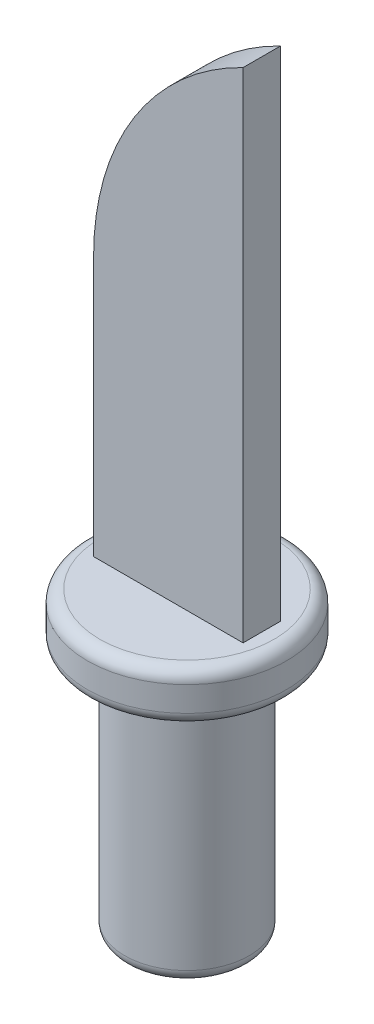
ISO-10303-21;
HEADER;
FILE_DESCRIPTION(('STEP AP214'),'2;1');
FILE_NAME('part.step','',(''),(''),'','','');
FILE_SCHEMA(('AUTOMOTIVE_DESIGN { 1 0 10303 214 1 1 1 1 }'));
ENDSEC;
DATA;
#1=APPLICATION_CONTEXT('core data for automotive mechanical design processes');
#2=APPLICATION_PROTOCOL_DEFINITION('international standard','automotive_design',2000,#1);
#3=PRODUCT_CONTEXT('',#1,'mechanical');
#4=PRODUCT('Part','Part','',(#3));
#5=PRODUCT_RELATED_PRODUCT_CATEGORY('part','',(#4));
#6=PRODUCT_DEFINITION_FORMATION('','',#4);
#7=PRODUCT_DEFINITION_CONTEXT('part definition',#1,'design');
#8=PRODUCT_DEFINITION('design','',#6,#7);
#9=PRODUCT_DEFINITION_SHAPE('','',#8);
#10=(LENGTH_UNIT() NAMED_UNIT(*) SI_UNIT(.MILLI.,.METRE.));
#11=(NAMED_UNIT(*) PLANE_ANGLE_UNIT() SI_UNIT($,.RADIAN.));
#12=(NAMED_UNIT(*) SI_UNIT($,.STERADIAN.) SOLID_ANGLE_UNIT());
#13=UNCERTAINTY_MEASURE_WITH_UNIT(LENGTH_MEASURE(1.E-05),#10,'distance_accuracy_value','');
#14=(GEOMETRIC_REPRESENTATION_CONTEXT(3) GLOBAL_UNCERTAINTY_ASSIGNED_CONTEXT((#13)) GLOBAL_UNIT_ASSIGNED_CONTEXT((#10,
#11,#12)) REPRESENTATION_CONTEXT('',''));
#15=CARTESIAN_POINT('',(0.,0.,0.));
#16=DIRECTION('',(0.,0.,1.));
#17=DIRECTION('',(1.,0.,0.));
#18=AXIS2_PLACEMENT_3D('',#15,#16,#17);
#19=CARTESIAN_POINT('',(0.692849814534637,117.952562857232,0.));
#20=DIRECTION('',(0.,1.,0.));
#21=DIRECTION('',(0.,0.,1.));
#22=AXIS2_PLACEMENT_3D('',#19,#20,#21);
#23=PLANE('',#22);
#24=CARTESIAN_POINT('',(0.692849814534637,117.952562857232,0.));
#25=DIRECTION('',(0.,1.,0.));
#26=DIRECTION('',(0.,0.,1.));
#27=AXIS2_PLACEMENT_3D('',#24,#25,#26);
#28=CIRCLE('',#27,1.75);
#29=CARTESIAN_POINT('',(0.692849814534637,117.952562857232,1.75));
#30=VERTEX_POINT('',#29);
#31=EDGE_CURVE('E119',#30,#30,#28,.T.);
#32=ORIENTED_EDGE('',*,*,#31,.T.);
#33=EDGE_LOOP('',(#32));
#34=FACE_BOUND('',#33,.T.);
#35=DIRECTION('',(1.,0.,0.));
#36=VECTOR('',#35,1.);
#37=CARTESIAN_POINT('',(2.19284981453464,117.952562857232,0.374999999999998));
#38=LINE('',#37,#36);
#39=CARTESIAN_POINT('',(-0.807150185465362,117.952562857232,0.374999999999998));
#40=VERTEX_POINT('',#39);
#41=CARTESIAN_POINT('',(2.19284981453464,117.952562857232,0.374999999999998));
#42=VERTEX_POINT('',#41);
#43=EDGE_CURVE('E82',#40,#42,#38,.T.);
#44=ORIENTED_EDGE('',*,*,#43,.F.);
#45=DIRECTION('',(0.,0.,1.));
#46=VECTOR('',#45,1.);
#47=CARTESIAN_POINT('',(-0.807150185465362,117.952562857232,0.374999999999998));
#48=LINE('',#47,#46);
#49=CARTESIAN_POINT('',(-0.807150185465362,117.952562857232,-0.375000000000002));
#50=VERTEX_POINT('',#49);
#51=EDGE_CURVE('E94',#50,#40,#48,.T.);
#52=ORIENTED_EDGE('',*,*,#51,.F.);
#53=DIRECTION('',(-1.,0.,0.));
#54=VECTOR('',#53,1.);
#55=CARTESIAN_POINT('',(2.19284981453464,117.952562857232,-0.375000000000002));
#56=LINE('',#55,#54);
#57=CARTESIAN_POINT('',(2.19284981453464,117.952562857232,-0.375000000000002));
#58=VERTEX_POINT('',#57);
#59=EDGE_CURVE('E101',#58,#50,#56,.T.);
#60=ORIENTED_EDGE('',*,*,#59,.F.);
#61=DIRECTION('',(0.,0.,-1.));
#62=VECTOR('',#61,1.);
#63=CARTESIAN_POINT('',(2.19284981453464,117.952562857232,0.374999999999998));
#64=LINE('',#63,#62);
#65=EDGE_CURVE('E93',#42,#58,#64,.T.);
#66=ORIENTED_EDGE('',*,*,#65,.F.);
#67=EDGE_LOOP('',(#44,#52,#60,#66));
#68=FACE_BOUND('',#67,.T.);
#69=ADVANCED_FACE('F44',(#34,#68),#23,.T.);
#70=CARTESIAN_POINT('',(0.692849814534637,111.952562857232,0.));
#71=DIRECTION('',(0.,1.,0.));
#72=DIRECTION('',(0.,0.,1.));
#73=AXIS2_PLACEMENT_3D('',#70,#71,#72);
#74=PLANE('',#73);
#75=CARTESIAN_POINT('',(0.692849814534637,111.952562857232,0.));
#76=DIRECTION('',(0.,1.,0.));
#77=DIRECTION('',(0.,0.,1.));
#78=AXIS2_PLACEMENT_3D('',#75,#76,#77);
#79=CIRCLE('',#78,1.);
#80=CARTESIAN_POINT('',(0.692849814534637,111.952562857232,0.999999999999998));
#81=VERTEX_POINT('',#80);
#82=EDGE_CURVE('E116',#81,#81,#79,.F.);
#83=ORIENTED_EDGE('',*,*,#82,.T.);
#84=EDGE_LOOP('',(#83));
#85=FACE_BOUND('',#84,.T.);
#86=ADVANCED_FACE('F137',(#85),#74,.F.);
#87=CARTESIAN_POINT('',(0.692849814534637,111.952562857232,0.));
#88=DIRECTION('',(0.,1.,0.));
#89=DIRECTION('',(0.,0.,1.));
#90=AXIS2_PLACEMENT_3D('',#87,#88,#89);
#91=CYLINDRICAL_SURFACE('',#90,1.25);
#92=CARTESIAN_POINT('',(0.692849814534637,112.202562857232,0.));
#93=DIRECTION('',(0.,1.,0.));
#94=DIRECTION('',(0.,0.,1.));
#95=AXIS2_PLACEMENT_3D('',#92,#93,#94);
#96=CIRCLE('',#95,1.25);
#97=CARTESIAN_POINT('',(0.692849814534637,112.202562857232,1.25));
#98=VERTEX_POINT('',#97);
#99=EDGE_CURVE('E113',#98,#98,#96,.T.);
#100=ORIENTED_EDGE('',*,*,#99,.T.);
#101=EDGE_LOOP('',(#100));
#102=FACE_BOUND('',#101,.T.);
#103=CARTESIAN_POINT('',(0.692849814534637,116.952562857232,0.));
#104=DIRECTION('',(0.,1.,0.));
#105=DIRECTION('',(0.,0.,1.));
#106=AXIS2_PLACEMENT_3D('',#103,#104,#105);
#107=CIRCLE('',#106,1.25);
#108=CARTESIAN_POINT('',(0.692849814534637,116.952562857232,1.25));
#109=VERTEX_POINT('',#108);
#110=EDGE_CURVE('E110',#109,#109,#107,.T.);
#111=ORIENTED_EDGE('',*,*,#110,.F.);
#112=EDGE_LOOP('',(#111));
#113=FACE_BOUND('',#112,.T.);
#114=ADVANCED_FACE('F139',(#102,#113),#91,.T.);
#115=CARTESIAN_POINT('',(0.692849814534637,117.952562857232,0.));
#116=DIRECTION('',(0.,-1.,0.));
#117=DIRECTION('',(0.,0.,-1.));
#118=AXIS2_PLACEMENT_3D('',#115,#116,#117);
#119=CYLINDRICAL_SURFACE('',#118,2.);
#120=CARTESIAN_POINT('',(0.692849814534637,117.702562857232,0.));
#121=DIRECTION('',(0.,1.,0.));
#122=DIRECTION('',(0.,0.,1.));
#123=AXIS2_PLACEMENT_3D('',#120,#121,#122);
#124=CIRCLE('',#123,2.);
#125=CARTESIAN_POINT('',(0.692849814534637,117.702562857232,2.));
#126=VERTEX_POINT('',#125);
#127=EDGE_CURVE('E52',#126,#126,#124,.F.);
#128=ORIENTED_EDGE('',*,*,#127,.T.);
#129=EDGE_LOOP('',(#128));
#130=FACE_BOUND('',#129,.T.);
#131=CARTESIAN_POINT('',(0.692849814534637,117.202562857232,0.));
#132=DIRECTION('',(0.,1.,0.));
#133=DIRECTION('',(0.,0.,1.));
#134=AXIS2_PLACEMENT_3D('',#131,#132,#133);
#135=CIRCLE('',#134,2.);
#136=CARTESIAN_POINT('',(0.692849814534637,117.202562857232,2.));
#137=VERTEX_POINT('',#136);
#138=EDGE_CURVE('E122',#137,#137,#135,.T.);
#139=ORIENTED_EDGE('',*,*,#138,.T.);
#140=EDGE_LOOP('',(#139));
#141=FACE_BOUND('',#140,.T.);
#142=ADVANCED_FACE('F127',(#130,#141),#119,.T.);
#143=CARTESIAN_POINT('',(0.692849814534637,116.952562857232,0.));
#144=DIRECTION('',(0.,1.,0.));
#145=DIRECTION('',(0.,0.,1.));
#146=AXIS2_PLACEMENT_3D('',#143,#144,#145);
#147=PLANE('',#146);
#148=CARTESIAN_POINT('',(0.692849814534637,116.952562857232,0.));
#149=DIRECTION('',(0.,1.,0.));
#150=DIRECTION('',(0.,0.,1.));
#151=AXIS2_PLACEMENT_3D('',#148,#149,#150);
#152=CIRCLE('',#151,1.75);
#153=CARTESIAN_POINT('',(0.692849814534637,116.952562857232,1.75));
#154=VERTEX_POINT('',#153);
#155=EDGE_CURVE('E12',#154,#154,#152,.F.);
#156=ORIENTED_EDGE('',*,*,#155,.T.);
#157=EDGE_LOOP('',(#156));
#158=FACE_BOUND('',#157,.T.);
#159=ORIENTED_EDGE('',*,*,#110,.T.);
#160=EDGE_LOOP('',(#159));
#161=FACE_BOUND('',#160,.T.);
#162=ADVANCED_FACE('F155',(#158,#161),#147,.F.);
#163=CARTESIAN_POINT('',(0.692849814534637,112.202562857232,0.));
#164=DIRECTION('',(0.,1.,0.));
#165=DIRECTION('',(0.,0.,1.));
#166=AXIS2_PLACEMENT_3D('',#163,#164,#165);
#167=TOROIDAL_SURFACE('',#166,1.,0.25);
#168=ORIENTED_EDGE('',*,*,#82,.F.);
#169=EDGE_LOOP('',(#168));
#170=FACE_BOUND('',#169,.T.);
#171=ORIENTED_EDGE('',*,*,#99,.F.);
#172=EDGE_LOOP('',(#171));
#173=FACE_BOUND('',#172,.T.);
#174=ADVANCED_FACE('F133',(#170,#173),#167,.T.);
#175=CARTESIAN_POINT('',(0.692849814534637,117.702562857232,0.));
#176=DIRECTION('',(0.,1.,0.));
#177=DIRECTION('',(0.,0.,1.));
#178=AXIS2_PLACEMENT_3D('',#175,#176,#177);
#179=TOROIDAL_SURFACE('',#178,1.75,0.25);
#180=ORIENTED_EDGE('',*,*,#127,.F.);
#181=EDGE_LOOP('',(#180));
#182=FACE_BOUND('',#181,.T.);
#183=ORIENTED_EDGE('',*,*,#31,.F.);
#184=EDGE_LOOP('',(#183));
#185=FACE_BOUND('',#184,.T.);
#186=ADVANCED_FACE('F130',(#182,#185),#179,.T.);
#187=CARTESIAN_POINT('',(0.692849814534637,117.202562857232,0.));
#188=DIRECTION('',(0.,1.,0.));
#189=DIRECTION('',(0.,0.,1.));
#190=AXIS2_PLACEMENT_3D('',#187,#188,#189);
#191=TOROIDAL_SURFACE('',#190,1.75,0.25);
#192=ORIENTED_EDGE('',*,*,#155,.F.);
#193=EDGE_LOOP('',(#192));
#194=FACE_BOUND('',#193,.T.);
#195=ORIENTED_EDGE('',*,*,#138,.F.);
#196=EDGE_LOOP('',(#195));
#197=FACE_BOUND('',#196,.T.);
#198=ADVANCED_FACE('F46',(#194,#197),#191,.T.);
#199=CARTESIAN_POINT('',(-0.807150185465362,127.952562857232,0.374999999999998));
#200=DIRECTION('',(1.,0.,0.));
#201=DIRECTION('',(0.,0.,-1.));
#202=AXIS2_PLACEMENT_3D('',#199,#200,#201);
#203=PLANE('',#202);
#204=DIRECTION('',(0.,-1.,0.));
#205=VECTOR('',#204,1.);
#206=CARTESIAN_POINT('',(-0.807150185465362,127.952562857232,0.374999999999998));
#207=LINE('',#206,#205);
#208=CARTESIAN_POINT('',(-0.807150185465362,123.165643945073,0.374999999999998));
#209=VERTEX_POINT('',#208);
#210=EDGE_CURVE('E88',#209,#40,#207,.T.);
#211=ORIENTED_EDGE('',*,*,#210,.F.);
#212=DIRECTION('',(0.,0.,1.));
#213=VECTOR('',#212,1.);
#214=CARTESIAN_POINT('',(-0.807150185465362,123.165643945073,-2.));
#215=LINE('',#214,#213);
#216=CARTESIAN_POINT('',(-0.807150185465362,123.165643945073,-0.375000000000002));
#217=VERTEX_POINT('',#216);
#218=EDGE_CURVE('E198',#217,#209,#215,.T.);
#219=ORIENTED_EDGE('',*,*,#218,.F.);
#220=DIRECTION('',(0.,-1.,0.));
#221=VECTOR('',#220,1.);
#222=CARTESIAN_POINT('',(-0.807150185465362,127.952562857232,-0.375000000000002));
#223=LINE('',#222,#221);
#224=EDGE_CURVE('E106',#217,#50,#223,.T.);
#225=ORIENTED_EDGE('',*,*,#224,.T.);
#226=ORIENTED_EDGE('',*,*,#51,.T.);
#227=EDGE_LOOP('',(#211,#219,#225,#226));
#228=FACE_BOUND('',#227,.T.);
#229=ADVANCED_FACE('F176',(#228),#203,.F.);
#230=CARTESIAN_POINT('',(2.19284981453464,127.952562857232,0.374999999999998));
#231=DIRECTION('',(0.,0.,-1.));
#232=DIRECTION('',(-1.,0.,0.));
#233=AXIS2_PLACEMENT_3D('',#230,#231,#232);
#234=PLANE('',#233);
#235=DIRECTION('',(0.,-1.,0.));
#236=VECTOR('',#235,1.);
#237=CARTESIAN_POINT('',(2.19284981453464,127.952562857232,0.374999999999998));
#238=LINE('',#237,#236);
#239=CARTESIAN_POINT('',(2.19284981453464,127.952562857232,0.374999999999998));
#240=VERTEX_POINT('',#239);
#241=EDGE_CURVE('E85',#240,#42,#238,.T.);
#242=ORIENTED_EDGE('',*,*,#241,.F.);
#243=CARTESIAN_POINT('',(4.51194859313234,123.165643945073,0.374999999999998));
#244=DIRECTION('',(0.,0.,-1.));
#245=DIRECTION('',(1.,0.,0.));
#246=AXIS2_PLACEMENT_3D('',#243,#244,#245);
#247=CIRCLE('',#246,5.3190987785977);
#248=EDGE_CURVE('E68',#209,#240,#247,.T.);
#249=ORIENTED_EDGE('',*,*,#248,.F.);
#250=ORIENTED_EDGE('',*,*,#210,.T.);
#251=ORIENTED_EDGE('',*,*,#43,.T.);
#252=EDGE_LOOP('',(#242,#249,#250,#251));
#253=FACE_BOUND('',#252,.T.);
#254=ADVANCED_FACE('F84',(#253),#234,.F.);
#255=CARTESIAN_POINT('',(2.19284981453464,127.952562857232,0.374999999999998));
#256=DIRECTION('',(-1.,0.,0.));
#257=DIRECTION('',(0.,0.,1.));
#258=AXIS2_PLACEMENT_3D('',#255,#256,#257);
#259=PLANE('',#258);
#260=ORIENTED_EDGE('',*,*,#65,.T.);
#261=DIRECTION('',(0.,-1.,0.));
#262=VECTOR('',#261,1.);
#263=CARTESIAN_POINT('',(2.19284981453464,127.952562857232,-0.375000000000002));
#264=LINE('',#263,#262);
#265=CARTESIAN_POINT('',(2.19284981453464,127.952562857232,-0.375000000000002));
#266=VERTEX_POINT('',#265);
#267=EDGE_CURVE('E59',#266,#58,#264,.T.);
#268=ORIENTED_EDGE('',*,*,#267,.F.);
#269=DIRECTION('',(0.,0.,-1.));
#270=VECTOR('',#269,1.);
#271=CARTESIAN_POINT('',(2.19284981453464,127.952562857232,0.374999999999998));
#272=LINE('',#271,#270);
#273=EDGE_CURVE('E99',#240,#266,#272,.T.);
#274=ORIENTED_EDGE('',*,*,#273,.F.);
#275=ORIENTED_EDGE('',*,*,#241,.T.);
#276=EDGE_LOOP('',(#260,#268,#274,#275));
#277=FACE_BOUND('',#276,.T.);
#278=ADVANCED_FACE('F97',(#277),#259,.F.);
#279=CARTESIAN_POINT('',(2.19284981453464,127.952562857232,-0.375000000000002));
#280=DIRECTION('',(0.,0.,1.));
#281=DIRECTION('',(1.,0.,0.));
#282=AXIS2_PLACEMENT_3D('',#279,#280,#281);
#283=PLANE('',#282);
#284=ORIENTED_EDGE('',*,*,#224,.F.);
#285=CARTESIAN_POINT('',(4.51194859313234,123.165643945073,-0.375000000000002));
#286=DIRECTION('',(0.,0.,1.));
#287=DIRECTION('',(1.,0.,0.));
#288=AXIS2_PLACEMENT_3D('',#285,#286,#287);
#289=CIRCLE('',#288,5.3190987785977);
#290=EDGE_CURVE('E200',#217,#266,#289,.F.);
#291=ORIENTED_EDGE('',*,*,#290,.T.);
#292=ORIENTED_EDGE('',*,*,#267,.T.);
#293=ORIENTED_EDGE('',*,*,#59,.T.);
#294=EDGE_LOOP('',(#284,#291,#292,#293));
#295=FACE_BOUND('',#294,.T.);
#296=ADVANCED_FACE('F188',(#295),#283,.F.);
#297=CARTESIAN_POINT('',(4.51194859313234,123.165643945073,-2.));
#298=DIRECTION('',(0.,0.,1.));
#299=DIRECTION('',(1.,0.,0.));
#300=AXIS2_PLACEMENT_3D('',#297,#298,#299);
#301=CYLINDRICAL_SURFACE('',#300,5.3190987785977);
#302=ORIENTED_EDGE('',*,*,#218,.T.);
#303=ORIENTED_EDGE('',*,*,#248,.T.);
#304=ORIENTED_EDGE('',*,*,#273,.T.);
#305=ORIENTED_EDGE('',*,*,#290,.F.);
#306=EDGE_LOOP('',(#302,#303,#304,#305));
#307=FACE_BOUND('',#306,.T.);
#308=ADVANCED_FACE('F191',(#307),#301,.T.);
#309=CLOSED_SHELL('',(#69,#86,#114,#142,#162,#174,#186,#198,#229,#254,#278,#296,#308));
#310=MANIFOLD_SOLID_BREP('B2',#309);
#311=ADVANCED_BREP_SHAPE_REPRESENTATION('',(#18,#310),#14);
#312=SHAPE_DEFINITION_REPRESENTATION(#9,#311);
ENDSEC;
END-ISO-10303-21;
